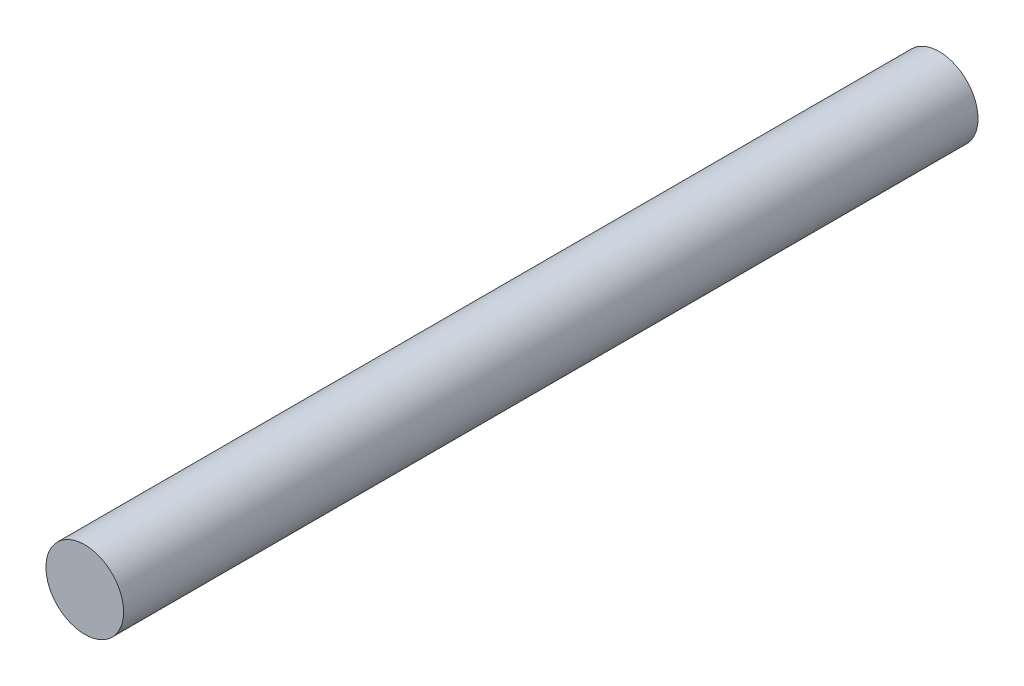
ISO-10303-21;
HEADER;
FILE_DESCRIPTION(('STEP AP214'),'2;1');
FILE_NAME('part.step','',(''),(''),'','','');
FILE_SCHEMA(('AUTOMOTIVE_DESIGN { 1 0 10303 214 1 1 1 1 }'));
ENDSEC;
DATA;
#1=APPLICATION_CONTEXT('core data for automotive mechanical design processes');
#2=APPLICATION_PROTOCOL_DEFINITION('international standard','automotive_design',2000,#1);
#3=PRODUCT_CONTEXT('',#1,'mechanical');
#4=PRODUCT('Part','Part','',(#3));
#5=PRODUCT_RELATED_PRODUCT_CATEGORY('part','',(#4));
#6=PRODUCT_DEFINITION_FORMATION('','',#4);
#7=PRODUCT_DEFINITION_CONTEXT('part definition',#1,'design');
#8=PRODUCT_DEFINITION('design','',#6,#7);
#9=PRODUCT_DEFINITION_SHAPE('','',#8);
#10=(LENGTH_UNIT() NAMED_UNIT(*) SI_UNIT(.MILLI.,.METRE.));
#11=(NAMED_UNIT(*) PLANE_ANGLE_UNIT() SI_UNIT($,.RADIAN.));
#12=(NAMED_UNIT(*) SI_UNIT($,.STERADIAN.) SOLID_ANGLE_UNIT());
#13=UNCERTAINTY_MEASURE_WITH_UNIT(LENGTH_MEASURE(1.E-05),#10,'distance_accuracy_value','');
#14=(GEOMETRIC_REPRESENTATION_CONTEXT(3) GLOBAL_UNCERTAINTY_ASSIGNED_CONTEXT((#13)) GLOBAL_UNIT_ASSIGNED_CONTEXT((#10,
#11,#12)) REPRESENTATION_CONTEXT('',''));
#15=CARTESIAN_POINT('',(0.,0.,0.));
#16=DIRECTION('',(0.,0.,1.));
#17=DIRECTION('',(1.,0.,0.));
#18=AXIS2_PLACEMENT_3D('',#15,#16,#17);
#19=CARTESIAN_POINT('',(0.,0.,88.));
#20=DIRECTION('',(0.,0.,-1.));
#21=DIRECTION('',(-1.,0.,0.));
#22=AXIS2_PLACEMENT_3D('',#19,#20,#21);
#23=CYLINDRICAL_SURFACE('',#22,4.);
#24=CARTESIAN_POINT('',(0.,0.,88.));
#25=DIRECTION('',(0.,0.,1.));
#26=DIRECTION('',(1.,0.,0.));
#27=AXIS2_PLACEMENT_3D('',#24,#25,#26);
#28=CIRCLE('',#27,4.);
#29=CARTESIAN_POINT('',(4.,0.,88.));
#30=VERTEX_POINT('',#29);
#31=EDGE_CURVE('E10',#30,#30,#28,.T.);
#32=ORIENTED_EDGE('',*,*,#31,.F.);
#33=EDGE_LOOP('',(#32));
#34=FACE_BOUND('',#33,.T.);
#35=CARTESIAN_POINT('',(0.,0.,0.));
#36=DIRECTION('',(0.,0.,1.));
#37=DIRECTION('',(1.,0.,0.));
#38=AXIS2_PLACEMENT_3D('',#35,#36,#37);
#39=CIRCLE('',#38,4.);
#40=CARTESIAN_POINT('',(4.,0.,0.));
#41=VERTEX_POINT('',#40);
#42=EDGE_CURVE('E34',#41,#41,#39,.T.);
#43=ORIENTED_EDGE('',*,*,#42,.T.);
#44=EDGE_LOOP('',(#43));
#45=FACE_BOUND('',#44,.T.);
#46=ADVANCED_FACE('F31',(#34,#45),#23,.T.);
#47=CARTESIAN_POINT('',(0.,0.,88.));
#48=DIRECTION('',(0.,0.,1.));
#49=DIRECTION('',(1.,0.,0.));
#50=AXIS2_PLACEMENT_3D('',#47,#48,#49);
#51=PLANE('',#50);
#52=ORIENTED_EDGE('',*,*,#31,.T.);
#53=EDGE_LOOP('',(#52));
#54=FACE_BOUND('',#53,.T.);
#55=ADVANCED_FACE('F46',(#54),#51,.T.);
#56=CARTESIAN_POINT('',(0.,0.,0.));
#57=DIRECTION('',(0.,0.,1.));
#58=DIRECTION('',(1.,0.,0.));
#59=AXIS2_PLACEMENT_3D('',#56,#57,#58);
#60=PLANE('',#59);
#61=ORIENTED_EDGE('',*,*,#42,.F.);
#62=EDGE_LOOP('',(#61));
#63=FACE_BOUND('',#62,.T.);
#64=ADVANCED_FACE('F44',(#63),#60,.F.);
#65=CLOSED_SHELL('',(#46,#55,#64));
#66=MANIFOLD_SOLID_BREP('B2',#65);
#67=ADVANCED_BREP_SHAPE_REPRESENTATION('',(#18,#66),#14);
#68=SHAPE_DEFINITION_REPRESENTATION(#9,#67);
ENDSEC;
END-ISO-10303-21;
